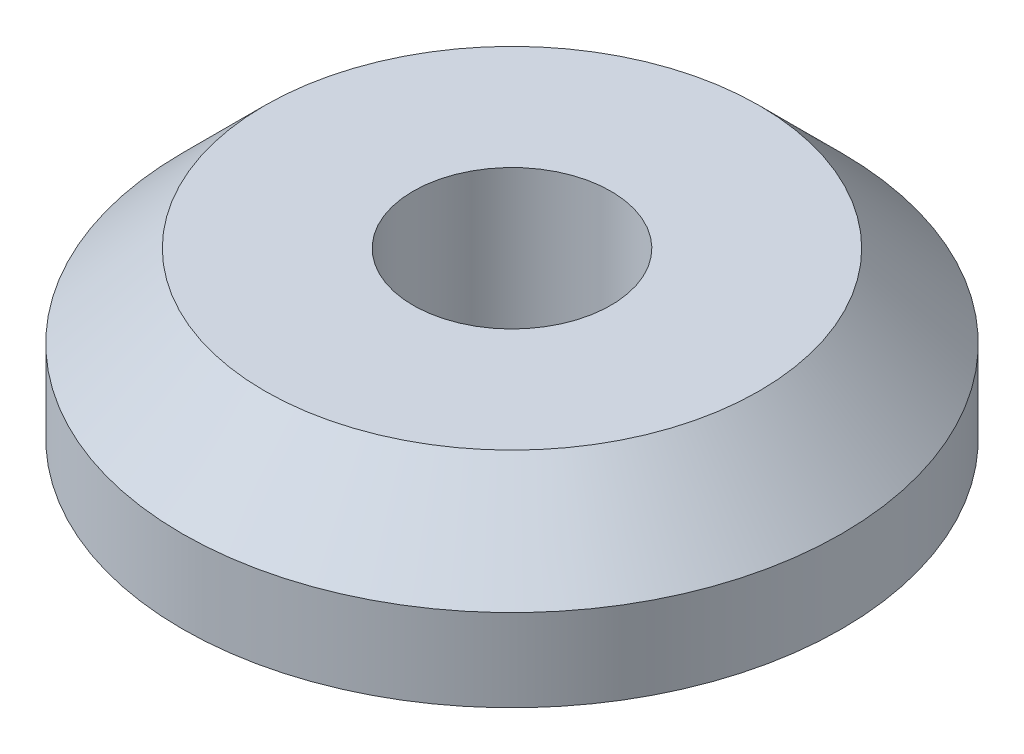
ISO-10303-21;
HEADER;
FILE_DESCRIPTION(('STEP AP214'),'2;1');
FILE_NAME('part.step','',(''),(''),'','','');
FILE_SCHEMA(('AUTOMOTIVE_DESIGN { 1 0 10303 214 1 1 1 1 }'));
ENDSEC;
DATA;
#1=APPLICATION_CONTEXT('core data for automotive mechanical design processes');
#2=APPLICATION_PROTOCOL_DEFINITION('international standard','automotive_design',2000,#1);
#3=PRODUCT_CONTEXT('',#1,'mechanical');
#4=PRODUCT('Part','Part','',(#3));
#5=PRODUCT_RELATED_PRODUCT_CATEGORY('part','',(#4));
#6=PRODUCT_DEFINITION_FORMATION('','',#4);
#7=PRODUCT_DEFINITION_CONTEXT('part definition',#1,'design');
#8=PRODUCT_DEFINITION('design','',#6,#7);
#9=PRODUCT_DEFINITION_SHAPE('','',#8);
#10=(LENGTH_UNIT() NAMED_UNIT(*) SI_UNIT(.MILLI.,.METRE.));
#11=(NAMED_UNIT(*) PLANE_ANGLE_UNIT() SI_UNIT($,.RADIAN.));
#12=(NAMED_UNIT(*) SI_UNIT($,.STERADIAN.) SOLID_ANGLE_UNIT());
#13=UNCERTAINTY_MEASURE_WITH_UNIT(LENGTH_MEASURE(1.E-05),#10,'distance_accuracy_value','');
#14=(GEOMETRIC_REPRESENTATION_CONTEXT(3) GLOBAL_UNCERTAINTY_ASSIGNED_CONTEXT((#13)) GLOBAL_UNIT_ASSIGNED_CONTEXT((#10,
#11,#12)) REPRESENTATION_CONTEXT('',''));
#15=CARTESIAN_POINT('',(0.,0.,0.));
#16=DIRECTION('',(0.,0.,1.));
#17=DIRECTION('',(1.,0.,0.));
#18=AXIS2_PLACEMENT_3D('',#15,#16,#17);
#19=CARTESIAN_POINT('',(-4.76249999999999,0.,0.));
#20=DIRECTION('',(0.,1.,0.));
#21=DIRECTION('',(-1.,0.,0.));
#22=AXIS2_PLACEMENT_3D('',#19,#20,#21);
#23=PLANE('',#22);
#24=CARTESIAN_POINT('',(0.,0.,0.));
#25=DIRECTION('',(0.,1.,0.));
#26=DIRECTION('',(-1.,0.,0.));
#27=AXIS2_PLACEMENT_3D('',#24,#25,#26);
#28=CIRCLE('',#27,4.76249999999999);
#29=CARTESIAN_POINT('',(-4.76249999999999,0.,0.));
#30=VERTEX_POINT('',#29);
#31=EDGE_CURVE('E59',#30,#30,#28,.T.);
#32=ORIENTED_EDGE('',*,*,#31,.T.);
#33=EDGE_LOOP('',(#32));
#34=FACE_BOUND('',#33,.T.);
#35=CARTESIAN_POINT('',(0.,0.,0.));
#36=DIRECTION('',(0.,1.,0.));
#37=DIRECTION('',(-1.,0.,0.));
#38=AXIS2_PLACEMENT_3D('',#35,#36,#37);
#39=CIRCLE('',#38,1.905);
#40=CARTESIAN_POINT('',(-1.905,0.,0.));
#41=VERTEX_POINT('',#40);
#42=EDGE_CURVE('E10',#41,#41,#39,.T.);
#43=ORIENTED_EDGE('',*,*,#42,.F.);
#44=EDGE_LOOP('',(#43));
#45=FACE_BOUND('',#44,.T.);
#46=ADVANCED_FACE('F34',(#34,#45),#23,.T.);
#47=CARTESIAN_POINT('',(0.,0.,0.));
#48=DIRECTION('',(0.,1.,0.));
#49=DIRECTION('',(-1.,0.,0.));
#50=AXIS2_PLACEMENT_3D('',#47,#48,#49);
#51=CYLINDRICAL_SURFACE('',#50,1.905);
#52=ORIENTED_EDGE('',*,*,#42,.T.);
#53=EDGE_LOOP('',(#52));
#54=FACE_BOUND('',#53,.T.);
#55=CARTESIAN_POINT('',(0.,-4.7498,0.));
#56=DIRECTION('',(0.,1.,0.));
#57=DIRECTION('',(-1.,0.,0.));
#58=AXIS2_PLACEMENT_3D('',#55,#56,#57);
#59=CIRCLE('',#58,1.905);
#60=CARTESIAN_POINT('',(-1.905,-4.7498,0.));
#61=VERTEX_POINT('',#60);
#62=EDGE_CURVE('E40',#61,#61,#59,.T.);
#63=ORIENTED_EDGE('',*,*,#62,.F.);
#64=EDGE_LOOP('',(#63));
#65=FACE_BOUND('',#64,.T.);
#66=ADVANCED_FACE('F77',(#54,#65),#51,.F.);
#67=CARTESIAN_POINT('',(-1.905,-4.7498,0.));
#68=DIRECTION('',(0.,-1.,0.));
#69=DIRECTION('',(1.,0.,0.));
#70=AXIS2_PLACEMENT_3D('',#67,#68,#69);
#71=PLANE('',#70);
#72=ORIENTED_EDGE('',*,*,#62,.T.);
#73=EDGE_LOOP('',(#72));
#74=FACE_BOUND('',#73,.T.);
#75=CARTESIAN_POINT('',(0.,-4.7498,0.));
#76=DIRECTION('',(0.,1.,0.));
#77=DIRECTION('',(-1.,0.,0.));
#78=AXIS2_PLACEMENT_3D('',#75,#76,#77);
#79=CIRCLE('',#78,3.5687);
#80=CARTESIAN_POINT('',(-3.5687,-4.7498,0.));
#81=VERTEX_POINT('',#80);
#82=EDGE_CURVE('E44',#81,#81,#79,.T.);
#83=ORIENTED_EDGE('',*,*,#82,.F.);
#84=EDGE_LOOP('',(#83));
#85=FACE_BOUND('',#84,.T.);
#86=ADVANCED_FACE('F81',(#74,#85),#71,.T.);
#87=CARTESIAN_POINT('',(0.,0.,0.));
#88=DIRECTION('',(0.,1.,0.));
#89=DIRECTION('',(-1.,0.,0.));
#90=AXIS2_PLACEMENT_3D('',#87,#88,#89);
#91=CYLINDRICAL_SURFACE('',#90,3.5687);
#92=ORIENTED_EDGE('',*,*,#82,.T.);
#93=EDGE_LOOP('',(#92));
#94=FACE_BOUND('',#93,.T.);
#95=CARTESIAN_POINT('',(0.,-3.175,0.));
#96=DIRECTION('',(0.,1.,0.));
#97=DIRECTION('',(-1.,0.,0.));
#98=AXIS2_PLACEMENT_3D('',#95,#96,#97);
#99=CIRCLE('',#98,3.5687);
#100=CARTESIAN_POINT('',(-3.5687,-3.175,0.));
#101=VERTEX_POINT('',#100);
#102=EDGE_CURVE('E48',#101,#101,#99,.T.);
#103=ORIENTED_EDGE('',*,*,#102,.F.);
#104=EDGE_LOOP('',(#103));
#105=FACE_BOUND('',#104,.T.);
#106=ADVANCED_FACE('F85',(#94,#105),#91,.T.);
#107=CARTESIAN_POINT('',(-3.5687,-3.175,0.));
#108=DIRECTION('',(0.,-1.,0.));
#109=DIRECTION('',(1.,0.,0.));
#110=AXIS2_PLACEMENT_3D('',#107,#108,#109);
#111=PLANE('',#110);
#112=ORIENTED_EDGE('',*,*,#102,.T.);
#113=EDGE_LOOP('',(#112));
#114=FACE_BOUND('',#113,.T.);
#115=CARTESIAN_POINT('',(0.,-3.175,0.));
#116=DIRECTION('',(0.,1.,0.));
#117=DIRECTION('',(-1.,0.,0.));
#118=AXIS2_PLACEMENT_3D('',#115,#116,#117);
#119=CIRCLE('',#118,6.35);
#120=CARTESIAN_POINT('',(-6.35,-3.175,0.));
#121=VERTEX_POINT('',#120);
#122=EDGE_CURVE('E53',#121,#121,#119,.T.);
#123=ORIENTED_EDGE('',*,*,#122,.F.);
#124=EDGE_LOOP('',(#123));
#125=FACE_BOUND('',#124,.T.);
#126=ADVANCED_FACE('F73',(#114,#125),#111,.T.);
#127=CARTESIAN_POINT('',(0.,0.,0.));
#128=DIRECTION('',(0.,1.,0.));
#129=DIRECTION('',(-1.,0.,0.));
#130=AXIS2_PLACEMENT_3D('',#127,#128,#129);
#131=CYLINDRICAL_SURFACE('',#130,6.35);
#132=ORIENTED_EDGE('',*,*,#122,.T.);
#133=EDGE_LOOP('',(#132));
#134=FACE_BOUND('',#133,.T.);
#135=CARTESIAN_POINT('',(0.,-1.5875,0.));
#136=DIRECTION('',(0.,1.,0.));
#137=DIRECTION('',(-1.,0.,0.));
#138=AXIS2_PLACEMENT_3D('',#135,#136,#137);
#139=CIRCLE('',#138,6.35);
#140=CARTESIAN_POINT('',(-6.35,-1.5875,0.));
#141=VERTEX_POINT('',#140);
#142=EDGE_CURVE('E56',#141,#141,#139,.T.);
#143=ORIENTED_EDGE('',*,*,#142,.F.);
#144=EDGE_LOOP('',(#143));
#145=FACE_BOUND('',#144,.T.);
#146=ADVANCED_FACE('F67',(#134,#145),#131,.T.);
#147=CARTESIAN_POINT('',(0.,0.,0.));
#148=DIRECTION('',(0.,-1.,0.));
#149=DIRECTION('',(1.,0.,0.));
#150=AXIS2_PLACEMENT_3D('',#147,#148,#149);
#151=CONICAL_SURFACE('',#150,4.76249999999999,0.78539816339745);
#152=ORIENTED_EDGE('',*,*,#142,.T.);
#153=EDGE_LOOP('',(#152));
#154=FACE_BOUND('',#153,.T.);
#155=ORIENTED_EDGE('',*,*,#31,.F.);
#156=EDGE_LOOP('',(#155));
#157=FACE_BOUND('',#156,.T.);
#158=ADVANCED_FACE('F65',(#154,#157),#151,.T.);
#159=CLOSED_SHELL('',(#46,#66,#86,#106,#126,#146,#158));
#160=MANIFOLD_SOLID_BREP('B2',#159);
#161=ADVANCED_BREP_SHAPE_REPRESENTATION('',(#18,#160),#14);
#162=SHAPE_DEFINITION_REPRESENTATION(#9,#161);
ENDSEC;
END-ISO-10303-21;
